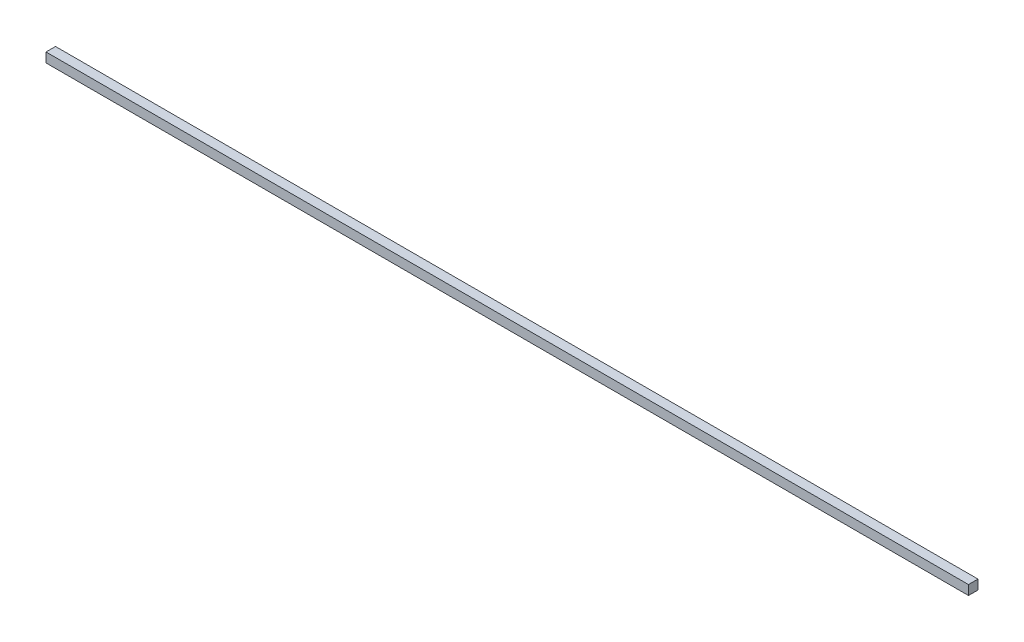
ISO-10303-21;
HEADER;
FILE_DESCRIPTION(('STEP AP214'),'2;1');
FILE_NAME('part.step','',(''),(''),'','','');
FILE_SCHEMA(('AUTOMOTIVE_DESIGN { 1 0 10303 214 1 1 1 1 }'));
ENDSEC;
DATA;
#1=APPLICATION_CONTEXT('core data for automotive mechanical design processes');
#2=APPLICATION_PROTOCOL_DEFINITION('international standard','automotive_design',2000,#1);
#3=PRODUCT_CONTEXT('',#1,'mechanical');
#4=PRODUCT('Part','Part','',(#3));
#5=PRODUCT_RELATED_PRODUCT_CATEGORY('part','',(#4));
#6=PRODUCT_DEFINITION_FORMATION('','',#4);
#7=PRODUCT_DEFINITION_CONTEXT('part definition',#1,'design');
#8=PRODUCT_DEFINITION('design','',#6,#7);
#9=PRODUCT_DEFINITION_SHAPE('','',#8);
#10=(LENGTH_UNIT() NAMED_UNIT(*) SI_UNIT(.MILLI.,.METRE.));
#11=(NAMED_UNIT(*) PLANE_ANGLE_UNIT() SI_UNIT($,.RADIAN.));
#12=(NAMED_UNIT(*) SI_UNIT($,.STERADIAN.) SOLID_ANGLE_UNIT());
#13=UNCERTAINTY_MEASURE_WITH_UNIT(LENGTH_MEASURE(1.E-05),#10,'distance_accuracy_value','');
#14=(GEOMETRIC_REPRESENTATION_CONTEXT(3) GLOBAL_UNCERTAINTY_ASSIGNED_CONTEXT((#13)) GLOBAL_UNIT_ASSIGNED_CONTEXT((#10,
#11,#12)) REPRESENTATION_CONTEXT('',''));
#15=CARTESIAN_POINT('',(0.,0.,0.));
#16=DIRECTION('',(0.,0.,1.));
#17=DIRECTION('',(1.,0.,0.));
#18=AXIS2_PLACEMENT_3D('',#15,#16,#17);
#19=CARTESIAN_POINT('',(0.,0.,19.05));
#20=DIRECTION('',(1.,0.,0.));
#21=DIRECTION('',(0.,0.,-1.));
#22=AXIS2_PLACEMENT_3D('',#19,#20,#21);
#23=PLANE('',#22);
#24=DIRECTION('',(0.,0.,-1.));
#25=VECTOR('',#24,1.);
#26=CARTESIAN_POINT('',(0.,3.175,19.05));
#27=LINE('',#26,#25);
#28=CARTESIAN_POINT('',(0.,3.175,19.05));
#29=VERTEX_POINT('',#28);
#30=CARTESIAN_POINT('',(0.,3.175,15.875));
#31=VERTEX_POINT('',#30);
#32=EDGE_CURVE('E93',#29,#31,#27,.T.);
#33=ORIENTED_EDGE('',*,*,#32,.T.);
#34=DIRECTION('',(0.,1.,0.));
#35=VECTOR('',#34,1.);
#36=CARTESIAN_POINT('',(0.,-0.00100000000000013,15.875));
#37=LINE('',#36,#35);
#38=CARTESIAN_POINT('',(0.,0.,15.875));
#39=VERTEX_POINT('',#38);
#40=EDGE_CURVE('E54',#39,#31,#37,.T.);
#41=ORIENTED_EDGE('',*,*,#40,.F.);
#42=DIRECTION('',(0.,0.,-1.));
#43=VECTOR('',#42,1.);
#44=CARTESIAN_POINT('',(0.,0.,19.05));
#45=LINE('',#44,#43);
#46=CARTESIAN_POINT('',(0.,0.,19.05));
#47=VERTEX_POINT('',#46);
#48=EDGE_CURVE('E11',#47,#39,#45,.T.);
#49=ORIENTED_EDGE('',*,*,#48,.F.);
#50=DIRECTION('',(0.,-1.,0.));
#51=VECTOR('',#50,1.);
#52=CARTESIAN_POINT('',(0.,0.,19.05));
#53=LINE('',#52,#51);
#54=EDGE_CURVE('E87',#29,#47,#53,.T.);
#55=ORIENTED_EDGE('',*,*,#54,.F.);
#56=EDGE_LOOP('',(#33,#41,#49,#55));
#57=FACE_BOUND('',#56,.T.);
#58=ADVANCED_FACE('F39',(#57),#23,.F.);
#59=CARTESIAN_POINT('',(0.,0.,19.05));
#60=DIRECTION('',(0.,1.,0.));
#61=DIRECTION('',(0.,0.,1.));
#62=AXIS2_PLACEMENT_3D('',#59,#60,#61);
#63=PLANE('',#62);
#64=ORIENTED_EDGE('',*,*,#48,.T.);
#65=DIRECTION('',(-1.,0.,0.));
#66=VECTOR('',#65,1.);
#67=CARTESIAN_POINT('',(0.,0.,15.875));
#68=LINE('',#67,#66);
#69=CARTESIAN_POINT('',(307.975,0.,15.875));
#70=VERTEX_POINT('',#69);
#71=EDGE_CURVE('E79',#70,#39,#68,.T.);
#72=ORIENTED_EDGE('',*,*,#71,.F.);
#73=DIRECTION('',(0.,0.,-1.));
#74=VECTOR('',#73,1.);
#75=CARTESIAN_POINT('',(307.975,0.,19.05));
#76=LINE('',#75,#74);
#77=CARTESIAN_POINT('',(307.975,0.,19.05));
#78=VERTEX_POINT('',#77);
#79=EDGE_CURVE('E47',#78,#70,#76,.T.);
#80=ORIENTED_EDGE('',*,*,#79,.F.);
#81=DIRECTION('',(1.,0.,0.));
#82=VECTOR('',#81,1.);
#83=CARTESIAN_POINT('',(0.,0.,19.05));
#84=LINE('',#83,#82);
#85=EDGE_CURVE('E98',#47,#78,#84,.T.);
#86=ORIENTED_EDGE('',*,*,#85,.F.);
#87=EDGE_LOOP('',(#64,#72,#80,#86));
#88=FACE_BOUND('',#87,.T.);
#89=ADVANCED_FACE('F97',(#88),#63,.F.);
#90=CARTESIAN_POINT('',(307.975,0.,19.05));
#91=DIRECTION('',(-1.,0.,0.));
#92=DIRECTION('',(0.,0.,1.));
#93=AXIS2_PLACEMENT_3D('',#90,#91,#92);
#94=PLANE('',#93);
#95=ORIENTED_EDGE('',*,*,#79,.T.);
#96=DIRECTION('',(0.,1.,0.));
#97=VECTOR('',#96,1.);
#98=CARTESIAN_POINT('',(307.975,-0.00100000000000013,15.875));
#99=LINE('',#98,#97);
#100=CARTESIAN_POINT('',(307.975,3.175,15.875));
#101=VERTEX_POINT('',#100);
#102=EDGE_CURVE('E82',#70,#101,#99,.T.);
#103=ORIENTED_EDGE('',*,*,#102,.T.);
#104=DIRECTION('',(0.,0.,-1.));
#105=VECTOR('',#104,1.);
#106=CARTESIAN_POINT('',(307.975,3.175,19.05));
#107=LINE('',#106,#105);
#108=CARTESIAN_POINT('',(307.975,3.175,19.05));
#109=VERTEX_POINT('',#108);
#110=EDGE_CURVE('E113',#109,#101,#107,.T.);
#111=ORIENTED_EDGE('',*,*,#110,.F.);
#112=DIRECTION('',(0.,1.,0.));
#113=VECTOR('',#112,1.);
#114=CARTESIAN_POINT('',(307.975,0.,19.05));
#115=LINE('',#114,#113);
#116=EDGE_CURVE('E101',#78,#109,#115,.T.);
#117=ORIENTED_EDGE('',*,*,#116,.F.);
#118=EDGE_LOOP('',(#95,#103,#111,#117));
#119=FACE_BOUND('',#118,.T.);
#120=ADVANCED_FACE('F118',(#119),#94,.F.);
#121=CARTESIAN_POINT('',(0.,3.175,19.05));
#122=DIRECTION('',(0.,-1.,0.));
#123=DIRECTION('',(0.,0.,-1.));
#124=AXIS2_PLACEMENT_3D('',#121,#122,#123);
#125=PLANE('',#124);
#126=ORIENTED_EDGE('',*,*,#110,.T.);
#127=DIRECTION('',(1.,0.,0.));
#128=VECTOR('',#127,1.);
#129=CARTESIAN_POINT('',(0.,3.175,15.875));
#130=LINE('',#129,#128);
#131=EDGE_CURVE('E95',#31,#101,#130,.T.);
#132=ORIENTED_EDGE('',*,*,#131,.F.);
#133=ORIENTED_EDGE('',*,*,#32,.F.);
#134=DIRECTION('',(-1.,0.,0.));
#135=VECTOR('',#134,1.);
#136=CARTESIAN_POINT('',(0.,3.175,19.05));
#137=LINE('',#136,#135);
#138=EDGE_CURVE('E62',#109,#29,#137,.T.);
#139=ORIENTED_EDGE('',*,*,#138,.F.);
#140=EDGE_LOOP('',(#126,#132,#133,#139));
#141=FACE_BOUND('',#140,.T.);
#142=ADVANCED_FACE('F121',(#141),#125,.F.);
#143=CARTESIAN_POINT('',(0.,0.,19.05));
#144=DIRECTION('',(0.,0.,-1.));
#145=DIRECTION('',(-1.,0.,0.));
#146=AXIS2_PLACEMENT_3D('',#143,#144,#145);
#147=PLANE('',#146);
#148=ORIENTED_EDGE('',*,*,#54,.T.);
#149=ORIENTED_EDGE('',*,*,#85,.T.);
#150=ORIENTED_EDGE('',*,*,#116,.T.);
#151=ORIENTED_EDGE('',*,*,#138,.T.);
#152=EDGE_LOOP('',(#148,#149,#150,#151));
#153=FACE_BOUND('',#152,.T.);
#154=ADVANCED_FACE('F103',(#153),#147,.F.);
#155=CARTESIAN_POINT('',(0.,-0.00100000000000013,15.875));
#156=DIRECTION('',(0.,0.,1.));
#157=DIRECTION('',(1.,0.,0.));
#158=AXIS2_PLACEMENT_3D('',#155,#156,#157);
#159=PLANE('',#158);
#160=ORIENTED_EDGE('',*,*,#71,.T.);
#161=ORIENTED_EDGE('',*,*,#40,.T.);
#162=ORIENTED_EDGE('',*,*,#131,.T.);
#163=ORIENTED_EDGE('',*,*,#102,.F.);
#164=EDGE_LOOP('',(#160,#161,#162,#163));
#165=FACE_BOUND('',#164,.T.);
#166=ADVANCED_FACE('F80',(#165),#159,.F.);
#167=CLOSED_SHELL('',(#58,#89,#120,#142,#154,#166));
#168=MANIFOLD_SOLID_BREP('B2',#167);
#169=ADVANCED_BREP_SHAPE_REPRESENTATION('',(#18,#168),#14);
#170=SHAPE_DEFINITION_REPRESENTATION(#9,#169);
ENDSEC;
END-ISO-10303-21;
